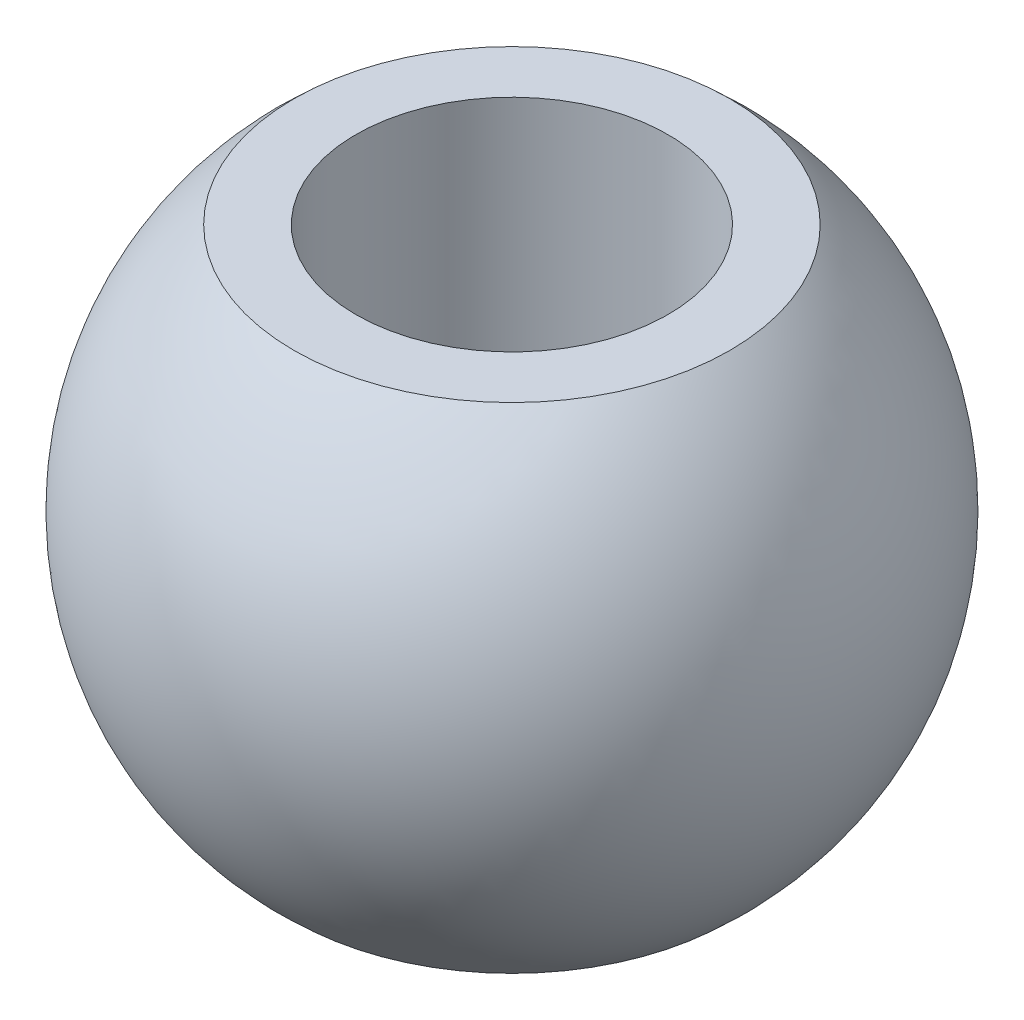
ISO-10303-21;
HEADER;
FILE_DESCRIPTION(('STEP AP214'),'2;1');
FILE_NAME('part.step','',(''),(''),'','','');
FILE_SCHEMA(('AUTOMOTIVE_DESIGN { 1 0 10303 214 1 1 1 1 }'));
ENDSEC;
DATA;
#1=APPLICATION_CONTEXT('core data for automotive mechanical design processes');
#2=APPLICATION_PROTOCOL_DEFINITION('international standard','automotive_design',2000,#1);
#3=PRODUCT_CONTEXT('',#1,'mechanical');
#4=PRODUCT('Part','Part','',(#3));
#5=PRODUCT_RELATED_PRODUCT_CATEGORY('part','',(#4));
#6=PRODUCT_DEFINITION_FORMATION('','',#4);
#7=PRODUCT_DEFINITION_CONTEXT('part definition',#1,'design');
#8=PRODUCT_DEFINITION('design','',#6,#7);
#9=PRODUCT_DEFINITION_SHAPE('','',#8);
#10=(LENGTH_UNIT() NAMED_UNIT(*) SI_UNIT(.MILLI.,.METRE.));
#11=(NAMED_UNIT(*) PLANE_ANGLE_UNIT() SI_UNIT($,.RADIAN.));
#12=(NAMED_UNIT(*) SI_UNIT($,.STERADIAN.) SOLID_ANGLE_UNIT());
#13=UNCERTAINTY_MEASURE_WITH_UNIT(LENGTH_MEASURE(1.E-05),#10,'distance_accuracy_value','');
#14=(GEOMETRIC_REPRESENTATION_CONTEXT(3) GLOBAL_UNCERTAINTY_ASSIGNED_CONTEXT((#13)) GLOBAL_UNIT_ASSIGNED_CONTEXT((#10,
#11,#12)) REPRESENTATION_CONTEXT('',''));
#15=CARTESIAN_POINT('',(0.,0.,0.));
#16=DIRECTION('',(0.,0.,1.));
#17=DIRECTION('',(1.,0.,0.));
#18=AXIS2_PLACEMENT_3D('',#15,#16,#17);
#19=CARTESIAN_POINT('',(0.,0.,0.));
#20=DIRECTION('',(0.,1.,0.));
#21=DIRECTION('',(1.,0.,0.));
#22=AXIS2_PLACEMENT_3D('',#19,#20,#21);
#23=SPHERICAL_SURFACE('',#22,2.3876);
#24=CARTESIAN_POINT('',(0.,1.7907,0.));
#25=DIRECTION('',(0.,1.,0.));
#26=DIRECTION('',(0.,0.,1.));
#27=AXIS2_PLACEMENT_3D('',#24,#25,#26);
#28=CIRCLE('',#27,1.57924895757445);
#29=CARTESIAN_POINT('',(1.57924895757446,1.7907,0.));
#30=VERTEX_POINT('',#29);
#31=EDGE_CURVE('E10',#30,#30,#28,.T.);
#32=CARTESIAN_POINT('',(0.,-1.7907,0.));
#33=DIRECTION('',(0.,-1.,0.));
#34=DIRECTION('',(0.,0.,-1.));
#35=AXIS2_PLACEMENT_3D('',#32,#33,#34);
#36=CIRCLE('',#35,1.57924895757445);
#37=CARTESIAN_POINT('',(1.57924895757446,-1.7907,0.));
#38=VERTEX_POINT('',#37);
#39=EDGE_CURVE('E34',#38,#38,#36,.T.);
#40=CARTESIAN_POINT('',(1.57924895757446,1.7907,0.));
#41=CARTESIAN_POINT('',(1.610887761936,1.76279869906884,0.));
#42=CARTESIAN_POINT('',(1.64178556518577,1.73405733833127,0.));
#43=CARTESIAN_POINT('',(1.7020158526307,1.67497875977748,0.));
#44=CARTESIAN_POINT('',(1.73134833682586,1.64464154196126,0.));
#45=CARTESIAN_POINT('',(1.78836466933053,1.58245551178435,0.));
#46=CARTESIAN_POINT('',(1.81604851764003,1.55060669942366,0.));
#47=CARTESIAN_POINT('',(1.86969007021856,1.48548718943588,0.));
#48=CARTESIAN_POINT('',(1.89564777448758,1.45221649180879,0.));
#49=CARTESIAN_POINT('',(1.94576406348231,1.38434659247204,0.));
#50=CARTESIAN_POINT('',(1.96992264820801,1.34974739076237,0.));
#51=CARTESIAN_POINT('',(2.01637286047796,1.27931768211622,0.));
#52=CARTESIAN_POINT('',(2.0386644880222,1.24348717517975,0.));
#53=CARTESIAN_POINT('',(2.08131816945039,1.17069549026317,0.));
#54=CARTESIAN_POINT('',(2.10168022333433,1.13373431228307,0.));
#55=CARTESIAN_POINT('',(2.14041756673271,1.05878510142992,0.));
#56=CARTESIAN_POINT('',(2.15879285624715,1.02079706855688,0.));
#57=CARTESIAN_POINT('',(2.19350505890176,0.943900846592028,0.));
#58=CARTESIAN_POINT('',(2.20984197204195,0.90499265750022,0.));
#59=CARTESIAN_POINT('',(2.24043153567631,0.826365406708626,0.));
#60=CARTESIAN_POINT('',(2.2546841861705,0.786646345008841,0.));
#61=CARTESIAN_POINT('',(2.28106519230456,0.706508910034345,0.));
#62=CARTESIAN_POINT('',(2.29319354794443,0.666090536759635,0.));
#63=CARTESIAN_POINT('',(2.3152918988137,0.584668003894173,0.));
#64=CARTESIAN_POINT('',(2.3252618940431,0.543663844303422,0.));
#65=CARTESIAN_POINT('',(2.34301552082949,0.461184909385643,0.));
#66=CARTESIAN_POINT('',(2.35079915238648,0.419710134058615,0.));
#67=CARTESIAN_POINT('',(2.36415818952522,0.336406460093993,0.));
#68=CARTESIAN_POINT('',(2.36973359510699,0.294577561456398,0.));
#69=CARTESIAN_POINT('',(2.37866052035456,0.210683127940866,0.));
#70=CARTESIAN_POINT('',(2.38201204002037,0.168617593062928,0.));
#71=CARTESIAN_POINT('',(2.38648177984309,0.0843680387899935,0.));
#72=CARTESIAN_POINT('',(2.3876,0.0421840193949968,0.));
#73=CARTESIAN_POINT('',(2.3876,-0.0421840193949968,0.));
#74=CARTESIAN_POINT('',(2.38648177984309,-0.0843680387899935,0.));
#75=CARTESIAN_POINT('',(2.38201204002037,-0.168617593062928,0.));
#76=CARTESIAN_POINT('',(2.37866052035456,-0.210683127940866,0.));
#77=CARTESIAN_POINT('',(2.36973359510699,-0.294577561456398,0.));
#78=CARTESIAN_POINT('',(2.36415818952522,-0.336406460093993,0.));
#79=CARTESIAN_POINT('',(2.35079915238648,-0.419710134058615,0.));
#80=CARTESIAN_POINT('',(2.34301552082949,-0.461184909385643,0.));
#81=CARTESIAN_POINT('',(2.3252618940431,-0.543663844303422,0.));
#82=CARTESIAN_POINT('',(2.3152918988137,-0.584668003894173,0.));
#83=CARTESIAN_POINT('',(2.29319354794443,-0.666090536759635,0.));
#84=CARTESIAN_POINT('',(2.28106519230456,-0.706508910034345,0.));
#85=CARTESIAN_POINT('',(2.2546841861705,-0.786646345008841,0.));
#86=CARTESIAN_POINT('',(2.24043153567631,-0.826365406708626,0.));
#87=CARTESIAN_POINT('',(2.20984197204195,-0.90499265750022,0.));
#88=CARTESIAN_POINT('',(2.19350505890176,-0.943900846592028,0.));
#89=CARTESIAN_POINT('',(2.15879285624714,-1.02079706855688,0.));
#90=CARTESIAN_POINT('',(2.14041756673271,-1.05878510142992,0.));
#91=CARTESIAN_POINT('',(2.10168022333433,-1.13373431228307,0.));
#92=CARTESIAN_POINT('',(2.08131816945039,-1.17069549026317,0.));
#93=CARTESIAN_POINT('',(2.0386644880222,-1.24348717517975,0.));
#94=CARTESIAN_POINT('',(2.01637286047796,-1.27931768211622,0.));
#95=CARTESIAN_POINT('',(1.96992264820801,-1.34974739076237,0.));
#96=CARTESIAN_POINT('',(1.94576406348231,-1.38434659247204,0.));
#97=CARTESIAN_POINT('',(1.89564777448758,-1.45221649180879,0.));
#98=CARTESIAN_POINT('',(1.86969007021856,-1.48548718943588,0.));
#99=CARTESIAN_POINT('',(1.81604851764003,-1.55060669942366,0.));
#100=CARTESIAN_POINT('',(1.78836466933053,-1.58245551178435,0.));
#101=CARTESIAN_POINT('',(1.73134833682586,-1.64464154196126,0.));
#102=CARTESIAN_POINT('',(1.7020158526307,-1.67497875977748,0.));
#103=CARTESIAN_POINT('',(1.64178556518577,-1.73405733833127,0.));
#104=CARTESIAN_POINT('',(1.610887761936,-1.76279869906884,0.));
#105=CARTESIAN_POINT('',(1.57924895757446,-1.7907,0.));
#106=B_SPLINE_CURVE_WITH_KNOTS('',3,(#40,#41,#42,#43,#44,#45,#46,#47,#48,#49,#50,#51,#52,#53,
#54,#55,#56,#57,#58,#59,#60,#61,#62,#63,#64,#65,#66,#67,#68,#69,#70,#71,#72,#73,#74,#75,#76,#77,
#78,#79,#80,#81,#82,#83,#84,#85,#86,#87,#88,#89,#90,#91,#92,#93,#94,#95,#96,#97,#98,#99,#100,
#101,#102,#103,#104,#105),.UNSPECIFIED.,.F.,.F.,(4,2,2,2,2,2,2,2,2,2,2,2,2,2,2,2,2,2,2,2,2,2,2,
2,2,2,2,2,2,2,2,2,4),(0.,0.126537250223052,0.253074500446105,0.379611750669157,0.50614900089221,
0.632686251115263,0.759223501338315,0.885760751561368,1.01229800178442,1.13883525200747,
1.26537250223053,1.39190975245358,1.51844700267663,1.64498425289968,1.77152150312274,
1.89805875334579,2.02459600356884,2.15113325379189,2.27767050401495,2.404207754238,
2.53074500446105,2.6572822546841,2.78381950490716,2.91035675513021,3.03689400535326,
3.16343125557631,3.28996850579937,3.41650575602242,3.54304300624547,3.66958025646852,
3.79611750669158,3.92265475691463,4.04919200713768),.UNSPECIFIED.);
#107=EDGE_CURVE('BSEAM31',#30,#38,#106,.T.);
#108=ORIENTED_EDGE('',*,*,#31,.F.);
#109=ORIENTED_EDGE('',*,*,#39,.F.);
#110=ORIENTED_EDGE('',*,*,#107,.T.);
#111=ORIENTED_EDGE('',*,*,#107,.F.);
#112=EDGE_LOOP('',(#108,#110,#109,#111));
#113=FACE_BOUND('',#112,.T.);
#114=ADVANCED_FACE('F31',(#113),#23,.T.);
#115=CARTESIAN_POINT('',(0.,1.7907,0.));
#116=DIRECTION('',(0.,1.,0.));
#117=DIRECTION('',(0.,0.,1.));
#118=AXIS2_PLACEMENT_3D('',#115,#116,#117);
#119=PLANE('',#118);
#120=CARTESIAN_POINT('',(0.,1.7907,0.));
#121=DIRECTION('',(0.,1.,0.));
#122=DIRECTION('',(0.,0.,1.));
#123=AXIS2_PLACEMENT_3D('',#120,#121,#122);
#124=CIRCLE('',#123,1.1303);
#125=CARTESIAN_POINT('',(0.,1.7907,1.1303));
#126=VERTEX_POINT('',#125);
#127=EDGE_CURVE('E43',#126,#126,#124,.T.);
#128=ORIENTED_EDGE('',*,*,#127,.F.);
#129=EDGE_LOOP('',(#128));
#130=FACE_BOUND('',#129,.T.);
#131=ORIENTED_EDGE('',*,*,#31,.T.);
#132=EDGE_LOOP('',(#131));
#133=FACE_BOUND('',#132,.T.);
#134=ADVANCED_FACE('F58',(#130,#133),#119,.T.);
#135=CARTESIAN_POINT('',(0.,-1.7907,0.));
#136=DIRECTION('',(0.,-1.,0.));
#137=DIRECTION('',(0.,0.,1.));
#138=AXIS2_PLACEMENT_3D('',#135,#136,#137);
#139=PLANE('',#138);
#140=CARTESIAN_POINT('',(0.,-1.7907,0.));
#141=DIRECTION('',(0.,1.,0.));
#142=DIRECTION('',(0.,0.,1.));
#143=AXIS2_PLACEMENT_3D('',#140,#141,#142);
#144=CIRCLE('',#143,1.1303);
#145=CARTESIAN_POINT('',(0.,-1.7907,1.1303));
#146=VERTEX_POINT('',#145);
#147=EDGE_CURVE('E41',#146,#146,#144,.T.);
#148=ORIENTED_EDGE('',*,*,#147,.T.);
#149=EDGE_LOOP('',(#148));
#150=FACE_BOUND('',#149,.T.);
#151=ORIENTED_EDGE('',*,*,#39,.T.);
#152=EDGE_LOOP('',(#151));
#153=FACE_BOUND('',#152,.T.);
#154=ADVANCED_FACE('F49',(#150,#153),#139,.T.);
#155=CARTESIAN_POINT('',(0.,-1.7907,0.));
#156=DIRECTION('',(0.,1.,0.));
#157=DIRECTION('',(0.,0.,1.));
#158=AXIS2_PLACEMENT_3D('',#155,#156,#157);
#159=CYLINDRICAL_SURFACE('',#158,1.1303);
#160=ORIENTED_EDGE('',*,*,#147,.F.);
#161=EDGE_LOOP('',(#160));
#162=FACE_BOUND('',#161,.T.);
#163=ORIENTED_EDGE('',*,*,#127,.T.);
#164=EDGE_LOOP('',(#163));
#165=FACE_BOUND('',#164,.T.);
#166=ADVANCED_FACE('F52',(#162,#165),#159,.F.);
#167=CLOSED_SHELL('',(#114,#134,#154,#166));
#168=MANIFOLD_SOLID_BREP('B2',#167);
#169=ADVANCED_BREP_SHAPE_REPRESENTATION('',(#18,#168),#14);
#170=SHAPE_DEFINITION_REPRESENTATION(#9,#169);
ENDSEC;
END-ISO-10303-21;
